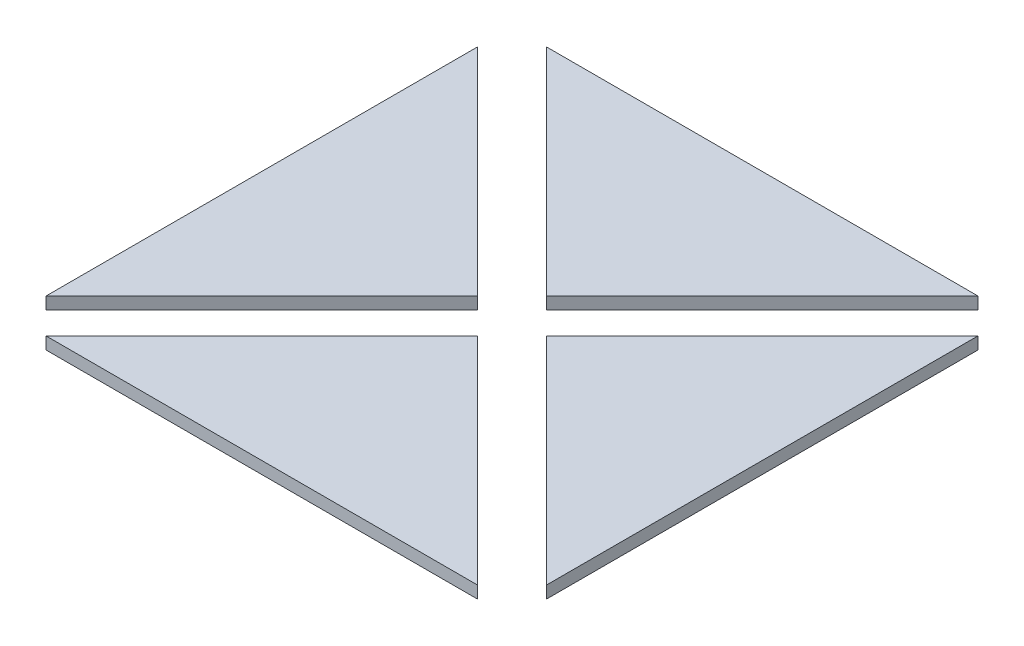
ISO-10303-21;
HEADER;
FILE_DESCRIPTION(('STEP AP214'),'2;1');
FILE_NAME('part.step','',(''),(''),'','','');
FILE_SCHEMA(('AUTOMOTIVE_DESIGN { 1 0 10303 214 1 1 1 1 }'));
ENDSEC;
DATA;
#1=APPLICATION_CONTEXT('core data for automotive mechanical design processes');
#2=APPLICATION_PROTOCOL_DEFINITION('international standard','automotive_design',2000,#1);
#3=PRODUCT_CONTEXT('',#1,'mechanical');
#4=PRODUCT('Part','Part','',(#3));
#5=PRODUCT_RELATED_PRODUCT_CATEGORY('part','',(#4));
#6=PRODUCT_DEFINITION_FORMATION('','',#4);
#7=PRODUCT_DEFINITION_CONTEXT('part definition',#1,'design');
#8=PRODUCT_DEFINITION('design','',#6,#7);
#9=PRODUCT_DEFINITION_SHAPE('','',#8);
#10=(LENGTH_UNIT() NAMED_UNIT(*) SI_UNIT(.MILLI.,.METRE.));
#11=(NAMED_UNIT(*) PLANE_ANGLE_UNIT() SI_UNIT($,.RADIAN.));
#12=(NAMED_UNIT(*) SI_UNIT($,.STERADIAN.) SOLID_ANGLE_UNIT());
#13=UNCERTAINTY_MEASURE_WITH_UNIT(LENGTH_MEASURE(1.E-05),#10,'distance_accuracy_value','');
#14=(GEOMETRIC_REPRESENTATION_CONTEXT(3) GLOBAL_UNCERTAINTY_ASSIGNED_CONTEXT((#13)) GLOBAL_UNIT_ASSIGNED_CONTEXT((#10,
#11,#12)) REPRESENTATION_CONTEXT('',''));
#15=CARTESIAN_POINT('',(0.,0.,0.));
#16=DIRECTION('',(0.,0.,1.));
#17=DIRECTION('',(1.,0.,0.));
#18=AXIS2_PLACEMENT_3D('',#15,#16,#17);
#19=CARTESIAN_POINT('',(-14.142135623731,10.,14.142135623731));
#20=DIRECTION('',(0.707106781186547,0.,-0.707106781186548));
#21=DIRECTION('',(-0.707106781186548,0.,-0.707106781186547));
#22=AXIS2_PLACEMENT_3D('',#19,#20,#21);
#23=PLANE('',#22);
#24=DIRECTION('',(0.707106781186548,0.,0.707106781186547));
#25=VECTOR('',#24,1.);
#26=CARTESIAN_POINT('',(-14.142135623731,0.,14.142135623731));
#27=LINE('',#26,#25);
#28=CARTESIAN_POINT('',(0.,0.,28.2842712474619));
#29=VERTEX_POINT('',#28);
#30=CARTESIAN_POINT('',(176.715728752538,0.,205.));
#31=VERTEX_POINT('',#30);
#32=EDGE_CURVE('E155',#29,#31,#27,.T.);
#33=ORIENTED_EDGE('',*,*,#32,.F.);
#34=DIRECTION('',(0.,-1.,0.));
#35=VECTOR('',#34,1.);
#36=CARTESIAN_POINT('',(0.,10.,28.2842712474619));
#37=LINE('',#36,#35);
#38=CARTESIAN_POINT('',(0.,10.,28.2842712474619));
#39=VERTEX_POINT('',#38);
#40=EDGE_CURVE('E13',#39,#29,#37,.T.);
#41=ORIENTED_EDGE('',*,*,#40,.F.);
#42=DIRECTION('',(0.707106781186548,0.,0.707106781186547));
#43=VECTOR('',#42,1.);
#44=CARTESIAN_POINT('',(-14.142135623731,10.,14.142135623731));
#45=LINE('',#44,#43);
#46=CARTESIAN_POINT('',(176.715728752538,10.,205.));
#47=VERTEX_POINT('',#46);
#48=EDGE_CURVE('E153',#39,#47,#45,.T.);
#49=ORIENTED_EDGE('',*,*,#48,.T.);
#50=DIRECTION('',(0.,-1.,0.));
#51=VECTOR('',#50,1.);
#52=CARTESIAN_POINT('',(176.715728752538,10.,205.));
#53=LINE('',#52,#51);
#54=EDGE_CURVE('E151',#47,#31,#53,.T.);
#55=ORIENTED_EDGE('',*,*,#54,.T.);
#56=EDGE_LOOP('',(#33,#41,#49,#55));
#57=FACE_BOUND('',#56,.T.);
#58=ADVANCED_FACE('F118',(#57),#23,.T.);
#59=CARTESIAN_POINT('',(14.1421356237309,10.,14.1421356237309));
#60=DIRECTION('',(-0.707106781186548,0.,-0.707106781186548));
#61=DIRECTION('',(-0.707106781186548,0.,0.707106781186548));
#62=AXIS2_PLACEMENT_3D('',#59,#60,#61);
#63=PLANE('',#62);
#64=DIRECTION('',(0.707106781186548,0.,-0.707106781186548));
#65=VECTOR('',#64,1.);
#66=CARTESIAN_POINT('',(14.1421356237309,0.,14.1421356237309));
#67=LINE('',#66,#65);
#68=CARTESIAN_POINT('',(-176.715728752538,0.,205.));
#69=VERTEX_POINT('',#68);
#70=EDGE_CURVE('E169',#69,#29,#67,.T.);
#71=ORIENTED_EDGE('',*,*,#70,.F.);
#72=DIRECTION('',(0.,-1.,0.));
#73=VECTOR('',#72,1.);
#74=CARTESIAN_POINT('',(-176.715728752538,10.,205.));
#75=LINE('',#74,#73);
#76=CARTESIAN_POINT('',(-176.715728752538,10.,205.));
#77=VERTEX_POINT('',#76);
#78=EDGE_CURVE('E126',#77,#69,#75,.T.);
#79=ORIENTED_EDGE('',*,*,#78,.F.);
#80=DIRECTION('',(0.707106781186548,0.,-0.707106781186548));
#81=VECTOR('',#80,1.);
#82=CARTESIAN_POINT('',(14.1421356237309,10.,14.1421356237309));
#83=LINE('',#82,#81);
#84=EDGE_CURVE('E161',#77,#39,#83,.T.);
#85=ORIENTED_EDGE('',*,*,#84,.T.);
#86=ORIENTED_EDGE('',*,*,#40,.T.);
#87=EDGE_LOOP('',(#71,#79,#85,#86));
#88=FACE_BOUND('',#87,.T.);
#89=ADVANCED_FACE('F164',(#88),#63,.T.);
#90=CARTESIAN_POINT('',(0.,10.,205.));
#91=DIRECTION('',(0.,0.,-1.));
#92=DIRECTION('',(-1.,0.,0.));
#93=AXIS2_PLACEMENT_3D('',#90,#91,#92);
#94=PLANE('',#93);
#95=DIRECTION('',(1.,0.,0.));
#96=VECTOR('',#95,1.);
#97=CARTESIAN_POINT('',(0.,0.,205.));
#98=LINE('',#97,#96);
#99=EDGE_CURVE('E162',#69,#31,#98,.T.);
#100=ORIENTED_EDGE('',*,*,#99,.T.);
#101=ORIENTED_EDGE('',*,*,#54,.F.);
#102=DIRECTION('',(1.,0.,0.));
#103=VECTOR('',#102,1.);
#104=CARTESIAN_POINT('',(0.,10.,205.));
#105=LINE('',#104,#103);
#106=EDGE_CURVE('E134',#77,#47,#105,.T.);
#107=ORIENTED_EDGE('',*,*,#106,.F.);
#108=ORIENTED_EDGE('',*,*,#78,.T.);
#109=EDGE_LOOP('',(#100,#101,#107,#108));
#110=FACE_BOUND('',#109,.T.);
#111=ADVANCED_FACE('F172',(#110),#94,.F.);
#112=CARTESIAN_POINT('',(0.,10.,0.));
#113=DIRECTION('',(0.,1.,0.));
#114=DIRECTION('',(0.,0.,1.));
#115=AXIS2_PLACEMENT_3D('',#112,#113,#114);
#116=PLANE('',#115);
#117=ORIENTED_EDGE('',*,*,#48,.F.);
#118=ORIENTED_EDGE('',*,*,#84,.F.);
#119=ORIENTED_EDGE('',*,*,#106,.T.);
#120=EDGE_LOOP('',(#117,#118,#119));
#121=FACE_BOUND('',#120,.T.);
#122=ADVANCED_FACE('F160',(#121),#116,.T.);
#123=CARTESIAN_POINT('',(0.,0.,0.));
#124=DIRECTION('',(0.,1.,0.));
#125=DIRECTION('',(0.,0.,1.));
#126=AXIS2_PLACEMENT_3D('',#123,#124,#125);
#127=PLANE('',#126);
#128=ORIENTED_EDGE('',*,*,#32,.T.);
#129=ORIENTED_EDGE('',*,*,#99,.F.);
#130=ORIENTED_EDGE('',*,*,#70,.T.);
#131=EDGE_LOOP('',(#128,#129,#130));
#132=FACE_BOUND('',#131,.T.);
#133=ADVANCED_FACE('F174',(#132),#127,.F.);
#134=CLOSED_SHELL('',(#58,#89,#111,#122,#133));
#135=MANIFOLD_SOLID_BREP('B2',#134);
#136=CARTESIAN_POINT('',(14.1421356237309,10.,14.1421356237309));
#137=DIRECTION('',(-0.707106781186548,0.,-0.707106781186548));
#138=DIRECTION('',(-0.707106781186548,0.,0.707106781186548));
#139=AXIS2_PLACEMENT_3D('',#136,#137,#138);
#140=PLANE('',#139);
#141=DIRECTION('',(0.707106781186548,0.,-0.707106781186548));
#142=VECTOR('',#141,1.);
#143=CARTESIAN_POINT('',(14.1421356237309,0.,14.1421356237309));
#144=LINE('',#143,#142);
#145=CARTESIAN_POINT('',(28.2842712474619,0.,0.));
#146=VERTEX_POINT('',#145);
#147=CARTESIAN_POINT('',(205.,0.,-176.715728752538));
#148=VERTEX_POINT('',#147);
#149=EDGE_CURVE('E266',#146,#148,#144,.T.);
#150=ORIENTED_EDGE('',*,*,#149,.F.);
#151=DIRECTION('',(0.,-1.,0.));
#152=VECTOR('',#151,1.);
#153=CARTESIAN_POINT('',(28.2842712474619,10.,0.));
#154=LINE('',#153,#152);
#155=CARTESIAN_POINT('',(28.2842712474619,10.,0.));
#156=VERTEX_POINT('',#155);
#157=EDGE_CURVE('E116',#156,#146,#154,.T.);
#158=ORIENTED_EDGE('',*,*,#157,.F.);
#159=DIRECTION('',(0.707106781186548,0.,-0.707106781186548));
#160=VECTOR('',#159,1.);
#161=CARTESIAN_POINT('',(14.1421356237309,10.,14.1421356237309));
#162=LINE('',#161,#160);
#163=CARTESIAN_POINT('',(205.,10.,-176.715728752538));
#164=VERTEX_POINT('',#163);
#165=EDGE_CURVE('E264',#156,#164,#162,.T.);
#166=ORIENTED_EDGE('',*,*,#165,.T.);
#167=DIRECTION('',(0.,-1.,0.));
#168=VECTOR('',#167,1.);
#169=CARTESIAN_POINT('',(205.,10.,-176.715728752538));
#170=LINE('',#169,#168);
#171=EDGE_CURVE('E260',#164,#148,#170,.T.);
#172=ORIENTED_EDGE('',*,*,#171,.T.);
#173=EDGE_LOOP('',(#150,#158,#166,#172));
#174=FACE_BOUND('',#173,.T.);
#175=ADVANCED_FACE('F226',(#174),#140,.T.);
#176=CARTESIAN_POINT('',(14.1421356237309,10.,-14.1421356237309));
#177=DIRECTION('',(0.707106781186547,0.,-0.707106781186548));
#178=DIRECTION('',(-0.707106781186548,0.,-0.707106781186547));
#179=AXIS2_PLACEMENT_3D('',#176,#177,#178);
#180=PLANE('',#179);
#181=DIRECTION('',(0.707106781186548,0.,0.707106781186547));
#182=VECTOR('',#181,1.);
#183=CARTESIAN_POINT('',(14.1421356237309,0.,-14.1421356237309));
#184=LINE('',#183,#182);
#185=CARTESIAN_POINT('',(205.,0.,176.715728752538));
#186=VERTEX_POINT('',#185);
#187=EDGE_CURVE('E254',#146,#186,#184,.T.);
#188=ORIENTED_EDGE('',*,*,#187,.T.);
#189=DIRECTION('',(0.,-1.,0.));
#190=VECTOR('',#189,1.);
#191=CARTESIAN_POINT('',(205.,10.,176.715728752538));
#192=LINE('',#191,#190);
#193=CARTESIAN_POINT('',(205.,10.,176.715728752538));
#194=VERTEX_POINT('',#193);
#195=EDGE_CURVE('E234',#194,#186,#192,.T.);
#196=ORIENTED_EDGE('',*,*,#195,.F.);
#197=DIRECTION('',(0.707106781186548,0.,0.707106781186547));
#198=VECTOR('',#197,1.);
#199=CARTESIAN_POINT('',(14.1421356237309,10.,-14.1421356237309));
#200=LINE('',#199,#198);
#201=EDGE_CURVE('E267',#156,#194,#200,.T.);
#202=ORIENTED_EDGE('',*,*,#201,.F.);
#203=ORIENTED_EDGE('',*,*,#157,.T.);
#204=EDGE_LOOP('',(#188,#196,#202,#203));
#205=FACE_BOUND('',#204,.T.);
#206=ADVANCED_FACE('F268',(#205),#180,.F.);
#207=CARTESIAN_POINT('',(205.,10.,0.));
#208=DIRECTION('',(-1.,0.,0.));
#209=DIRECTION('',(0.,0.,1.));
#210=AXIS2_PLACEMENT_3D('',#207,#208,#209);
#211=PLANE('',#210);
#212=DIRECTION('',(0.,0.,-1.));
#213=VECTOR('',#212,1.);
#214=CARTESIAN_POINT('',(205.,0.,0.));
#215=LINE('',#214,#213);
#216=EDGE_CURVE('E271',#186,#148,#215,.T.);
#217=ORIENTED_EDGE('',*,*,#216,.T.);
#218=ORIENTED_EDGE('',*,*,#171,.F.);
#219=DIRECTION('',(0.,0.,-1.));
#220=VECTOR('',#219,1.);
#221=CARTESIAN_POINT('',(205.,10.,0.));
#222=LINE('',#221,#220);
#223=EDGE_CURVE('E242',#194,#164,#222,.T.);
#224=ORIENTED_EDGE('',*,*,#223,.F.);
#225=ORIENTED_EDGE('',*,*,#195,.T.);
#226=EDGE_LOOP('',(#217,#218,#224,#225));
#227=FACE_BOUND('',#226,.T.);
#228=ADVANCED_FACE('F280',(#227),#211,.F.);
#229=CARTESIAN_POINT('',(0.,10.,0.));
#230=DIRECTION('',(0.,1.,0.));
#231=DIRECTION('',(0.,0.,1.));
#232=AXIS2_PLACEMENT_3D('',#229,#230,#231);
#233=PLANE('',#232);
#234=ORIENTED_EDGE('',*,*,#165,.F.);
#235=ORIENTED_EDGE('',*,*,#201,.T.);
#236=ORIENTED_EDGE('',*,*,#223,.T.);
#237=EDGE_LOOP('',(#234,#235,#236));
#238=FACE_BOUND('',#237,.T.);
#239=ADVANCED_FACE('F270',(#238),#233,.T.);
#240=CARTESIAN_POINT('',(0.,0.,0.));
#241=DIRECTION('',(0.,1.,0.));
#242=DIRECTION('',(0.,0.,1.));
#243=AXIS2_PLACEMENT_3D('',#240,#241,#242);
#244=PLANE('',#243);
#245=ORIENTED_EDGE('',*,*,#149,.T.);
#246=ORIENTED_EDGE('',*,*,#216,.F.);
#247=ORIENTED_EDGE('',*,*,#187,.F.);
#248=EDGE_LOOP('',(#245,#246,#247));
#249=FACE_BOUND('',#248,.T.);
#250=ADVANCED_FACE('F282',(#249),#244,.F.);
#251=CLOSED_SHELL('',(#175,#206,#228,#239,#250));
#252=MANIFOLD_SOLID_BREP('B7',#251);
#253=CARTESIAN_POINT('',(0.,10.,-205.));
#254=DIRECTION('',(0.,0.,-1.));
#255=DIRECTION('',(-1.,0.,0.));
#256=AXIS2_PLACEMENT_3D('',#253,#254,#255);
#257=PLANE('',#256);
#258=DIRECTION('',(1.,0.,0.));
#259=VECTOR('',#258,1.);
#260=CARTESIAN_POINT('',(0.,0.,-205.));
#261=LINE('',#260,#259);
#262=CARTESIAN_POINT('',(-176.715728752538,0.,-205.));
#263=VERTEX_POINT('',#262);
#264=CARTESIAN_POINT('',(176.715728752538,0.,-205.));
#265=VERTEX_POINT('',#264);
#266=EDGE_CURVE('E373',#263,#265,#261,.T.);
#267=ORIENTED_EDGE('',*,*,#266,.F.);
#268=DIRECTION('',(0.,-1.,0.));
#269=VECTOR('',#268,1.);
#270=CARTESIAN_POINT('',(-176.715728752538,10.,-205.));
#271=LINE('',#270,#269);
#272=CARTESIAN_POINT('',(-176.715728752538,10.,-205.));
#273=VERTEX_POINT('',#272);
#274=EDGE_CURVE('E224',#273,#263,#271,.T.);
#275=ORIENTED_EDGE('',*,*,#274,.F.);
#276=DIRECTION('',(1.,0.,0.));
#277=VECTOR('',#276,1.);
#278=CARTESIAN_POINT('',(0.,10.,-205.));
#279=LINE('',#278,#277);
#280=CARTESIAN_POINT('',(176.715728752538,10.,-205.));
#281=VERTEX_POINT('',#280);
#282=EDGE_CURVE('E371',#273,#281,#279,.T.);
#283=ORIENTED_EDGE('',*,*,#282,.T.);
#284=DIRECTION('',(0.,-1.,0.));
#285=VECTOR('',#284,1.);
#286=CARTESIAN_POINT('',(176.715728752538,10.,-205.));
#287=LINE('',#286,#285);
#288=EDGE_CURVE('E367',#281,#265,#287,.T.);
#289=ORIENTED_EDGE('',*,*,#288,.T.);
#290=EDGE_LOOP('',(#267,#275,#283,#289));
#291=FACE_BOUND('',#290,.T.);
#292=ADVANCED_FACE('F333',(#291),#257,.T.);
#293=CARTESIAN_POINT('',(14.1421356237309,10.,-14.1421356237309));
#294=DIRECTION('',(0.707106781186547,0.,-0.707106781186548));
#295=DIRECTION('',(-0.707106781186548,0.,-0.707106781186547));
#296=AXIS2_PLACEMENT_3D('',#293,#294,#295);
#297=PLANE('',#296);
#298=DIRECTION('',(0.707106781186548,0.,0.707106781186547));
#299=VECTOR('',#298,1.);
#300=CARTESIAN_POINT('',(14.1421356237309,0.,-14.1421356237309));
#301=LINE('',#300,#299);
#302=CARTESIAN_POINT('',(0.,0.,-28.2842712474619));
#303=VERTEX_POINT('',#302);
#304=EDGE_CURVE('E361',#263,#303,#301,.T.);
#305=ORIENTED_EDGE('',*,*,#304,.T.);
#306=DIRECTION('',(0.,-1.,0.));
#307=VECTOR('',#306,1.);
#308=CARTESIAN_POINT('',(0.,10.,-28.2842712474619));
#309=LINE('',#308,#307);
#310=CARTESIAN_POINT('',(0.,10.,-28.2842712474619));
#311=VERTEX_POINT('',#310);
#312=EDGE_CURVE('E341',#311,#303,#309,.T.);
#313=ORIENTED_EDGE('',*,*,#312,.F.);
#314=DIRECTION('',(0.707106781186548,0.,0.707106781186547));
#315=VECTOR('',#314,1.);
#316=CARTESIAN_POINT('',(14.1421356237309,10.,-14.1421356237309));
#317=LINE('',#316,#315);
#318=EDGE_CURVE('E374',#273,#311,#317,.T.);
#319=ORIENTED_EDGE('',*,*,#318,.F.);
#320=ORIENTED_EDGE('',*,*,#274,.T.);
#321=EDGE_LOOP('',(#305,#313,#319,#320));
#322=FACE_BOUND('',#321,.T.);
#323=ADVANCED_FACE('F375',(#322),#297,.F.);
#324=CARTESIAN_POINT('',(-14.142135623731,10.,-14.142135623731));
#325=DIRECTION('',(-0.707106781186547,0.,-0.707106781186548));
#326=DIRECTION('',(-0.707106781186548,0.,0.707106781186547));
#327=AXIS2_PLACEMENT_3D('',#324,#325,#326);
#328=PLANE('',#327);
#329=DIRECTION('',(0.707106781186548,0.,-0.707106781186547));
#330=VECTOR('',#329,1.);
#331=CARTESIAN_POINT('',(-14.142135623731,0.,-14.142135623731));
#332=LINE('',#331,#330);
#333=EDGE_CURVE('E378',#303,#265,#332,.T.);
#334=ORIENTED_EDGE('',*,*,#333,.T.);
#335=ORIENTED_EDGE('',*,*,#288,.F.);
#336=DIRECTION('',(0.707106781186548,0.,-0.707106781186547));
#337=VECTOR('',#336,1.);
#338=CARTESIAN_POINT('',(-14.142135623731,10.,-14.142135623731));
#339=LINE('',#338,#337);
#340=EDGE_CURVE('E349',#311,#281,#339,.T.);
#341=ORIENTED_EDGE('',*,*,#340,.F.);
#342=ORIENTED_EDGE('',*,*,#312,.T.);
#343=EDGE_LOOP('',(#334,#335,#341,#342));
#344=FACE_BOUND('',#343,.T.);
#345=ADVANCED_FACE('F387',(#344),#328,.F.);
#346=CARTESIAN_POINT('',(0.,10.,0.));
#347=DIRECTION('',(0.,1.,0.));
#348=DIRECTION('',(0.,0.,1.));
#349=AXIS2_PLACEMENT_3D('',#346,#347,#348);
#350=PLANE('',#349);
#351=ORIENTED_EDGE('',*,*,#282,.F.);
#352=ORIENTED_EDGE('',*,*,#318,.T.);
#353=ORIENTED_EDGE('',*,*,#340,.T.);
#354=EDGE_LOOP('',(#351,#352,#353));
#355=FACE_BOUND('',#354,.T.);
#356=ADVANCED_FACE('F377',(#355),#350,.T.);
#357=CARTESIAN_POINT('',(0.,0.,0.));
#358=DIRECTION('',(0.,1.,0.));
#359=DIRECTION('',(0.,0.,1.));
#360=AXIS2_PLACEMENT_3D('',#357,#358,#359);
#361=PLANE('',#360);
#362=ORIENTED_EDGE('',*,*,#266,.T.);
#363=ORIENTED_EDGE('',*,*,#333,.F.);
#364=ORIENTED_EDGE('',*,*,#304,.F.);
#365=EDGE_LOOP('',(#362,#363,#364));
#366=FACE_BOUND('',#365,.T.);
#367=ADVANCED_FACE('F389',(#366),#361,.F.);
#368=CLOSED_SHELL('',(#292,#323,#345,#356,#367));
#369=MANIFOLD_SOLID_BREP('B110',#368);
#370=CARTESIAN_POINT('',(-14.142135623731,10.,14.142135623731));
#371=DIRECTION('',(0.707106781186547,0.,-0.707106781186548));
#372=DIRECTION('',(-0.707106781186548,0.,-0.707106781186547));
#373=AXIS2_PLACEMENT_3D('',#370,#371,#372);
#374=PLANE('',#373);
#375=DIRECTION('',(0.707106781186548,0.,0.707106781186547));
#376=VECTOR('',#375,1.);
#377=CARTESIAN_POINT('',(-14.142135623731,0.,14.142135623731));
#378=LINE('',#377,#376);
#379=CARTESIAN_POINT('',(-205.,0.,-176.715728752538));
#380=VERTEX_POINT('',#379);
#381=CARTESIAN_POINT('',(-28.284271247462,0.,0.));
#382=VERTEX_POINT('',#381);
#383=EDGE_CURVE('E468',#380,#382,#378,.T.);
#384=ORIENTED_EDGE('',*,*,#383,.F.);
#385=DIRECTION('',(0.,-1.,0.));
#386=VECTOR('',#385,1.);
#387=CARTESIAN_POINT('',(-205.,10.,-176.715728752538));
#388=LINE('',#387,#386);
#389=CARTESIAN_POINT('',(-205.,10.,-176.715728752538));
#390=VERTEX_POINT('',#389);
#391=EDGE_CURVE('E331',#390,#380,#388,.T.);
#392=ORIENTED_EDGE('',*,*,#391,.F.);
#393=DIRECTION('',(0.707106781186548,0.,0.707106781186547));
#394=VECTOR('',#393,1.);
#395=CARTESIAN_POINT('',(-14.142135623731,10.,14.142135623731));
#396=LINE('',#395,#394);
#397=CARTESIAN_POINT('',(-28.284271247462,10.,0.));
#398=VERTEX_POINT('',#397);
#399=EDGE_CURVE('E466',#390,#398,#396,.T.);
#400=ORIENTED_EDGE('',*,*,#399,.T.);
#401=DIRECTION('',(0.,-1.,0.));
#402=VECTOR('',#401,1.);
#403=CARTESIAN_POINT('',(-28.284271247462,10.,0.));
#404=LINE('',#403,#402);
#405=EDGE_CURVE('E464',#398,#382,#404,.T.);
#406=ORIENTED_EDGE('',*,*,#405,.T.);
#407=EDGE_LOOP('',(#384,#392,#400,#406));
#408=FACE_BOUND('',#407,.T.);
#409=ADVANCED_FACE('F431',(#408),#374,.T.);
#410=CARTESIAN_POINT('',(-205.,10.,0.));
#411=DIRECTION('',(-1.,0.,0.));
#412=DIRECTION('',(0.,0.,1.));
#413=AXIS2_PLACEMENT_3D('',#410,#411,#412);
#414=PLANE('',#413);
#415=DIRECTION('',(0.,0.,-1.));
#416=VECTOR('',#415,1.);
#417=CARTESIAN_POINT('',(-205.,0.,0.));
#418=LINE('',#417,#416);
#419=CARTESIAN_POINT('',(-205.,0.,176.715728752538));
#420=VERTEX_POINT('',#419);
#421=EDGE_CURVE('E482',#420,#380,#418,.T.);
#422=ORIENTED_EDGE('',*,*,#421,.F.);
#423=DIRECTION('',(0.,-1.,0.));
#424=VECTOR('',#423,1.);
#425=CARTESIAN_POINT('',(-205.,10.,176.715728752538));
#426=LINE('',#425,#424);
#427=CARTESIAN_POINT('',(-205.,10.,176.715728752538));
#428=VERTEX_POINT('',#427);
#429=EDGE_CURVE('E439',#428,#420,#426,.T.);
#430=ORIENTED_EDGE('',*,*,#429,.F.);
#431=DIRECTION('',(0.,0.,-1.));
#432=VECTOR('',#431,1.);
#433=CARTESIAN_POINT('',(-205.,10.,0.));
#434=LINE('',#433,#432);
#435=EDGE_CURVE('E474',#428,#390,#434,.T.);
#436=ORIENTED_EDGE('',*,*,#435,.T.);
#437=ORIENTED_EDGE('',*,*,#391,.T.);
#438=EDGE_LOOP('',(#422,#430,#436,#437));
#439=FACE_BOUND('',#438,.T.);
#440=ADVANCED_FACE('F477',(#439),#414,.T.);
#441=CARTESIAN_POINT('',(-14.142135623731,10.,-14.142135623731));
#442=DIRECTION('',(-0.707106781186547,0.,-0.707106781186548));
#443=DIRECTION('',(-0.707106781186548,0.,0.707106781186547));
#444=AXIS2_PLACEMENT_3D('',#441,#442,#443);
#445=PLANE('',#444);
#446=DIRECTION('',(0.707106781186548,0.,-0.707106781186547));
#447=VECTOR('',#446,1.);
#448=CARTESIAN_POINT('',(-14.142135623731,0.,-14.142135623731));
#449=LINE('',#448,#447);
#450=EDGE_CURVE('E475',#420,#382,#449,.T.);
#451=ORIENTED_EDGE('',*,*,#450,.T.);
#452=ORIENTED_EDGE('',*,*,#405,.F.);
#453=DIRECTION('',(0.707106781186548,0.,-0.707106781186547));
#454=VECTOR('',#453,1.);
#455=CARTESIAN_POINT('',(-14.142135623731,10.,-14.142135623731));
#456=LINE('',#455,#454);
#457=EDGE_CURVE('E447',#428,#398,#456,.T.);
#458=ORIENTED_EDGE('',*,*,#457,.F.);
#459=ORIENTED_EDGE('',*,*,#429,.T.);
#460=EDGE_LOOP('',(#451,#452,#458,#459));
#461=FACE_BOUND('',#460,.T.);
#462=ADVANCED_FACE('F485',(#461),#445,.F.);
#463=CARTESIAN_POINT('',(0.,10.,0.));
#464=DIRECTION('',(0.,1.,0.));
#465=DIRECTION('',(0.,0.,1.));
#466=AXIS2_PLACEMENT_3D('',#463,#464,#465);
#467=PLANE('',#466);
#468=ORIENTED_EDGE('',*,*,#399,.F.);
#469=ORIENTED_EDGE('',*,*,#435,.F.);
#470=ORIENTED_EDGE('',*,*,#457,.T.);
#471=EDGE_LOOP('',(#468,#469,#470));
#472=FACE_BOUND('',#471,.T.);
#473=ADVANCED_FACE('F473',(#472),#467,.T.);
#474=CARTESIAN_POINT('',(0.,0.,0.));
#475=DIRECTION('',(0.,1.,0.));
#476=DIRECTION('',(0.,0.,1.));
#477=AXIS2_PLACEMENT_3D('',#474,#475,#476);
#478=PLANE('',#477);
#479=ORIENTED_EDGE('',*,*,#383,.T.);
#480=ORIENTED_EDGE('',*,*,#450,.F.);
#481=ORIENTED_EDGE('',*,*,#421,.T.);
#482=EDGE_LOOP('',(#479,#480,#481));
#483=FACE_BOUND('',#482,.T.);
#484=ADVANCED_FACE('F487',(#483),#478,.F.);
#485=CLOSED_SHELL('',(#409,#440,#462,#473,#484));
#486=MANIFOLD_SOLID_BREP('B218',#485);
#487=ADVANCED_BREP_SHAPE_REPRESENTATION('',(#18,#135,#252,#369,#486),#14);
#488=SHAPE_DEFINITION_REPRESENTATION(#9,#487);
ENDSEC;
END-ISO-10303-21;
